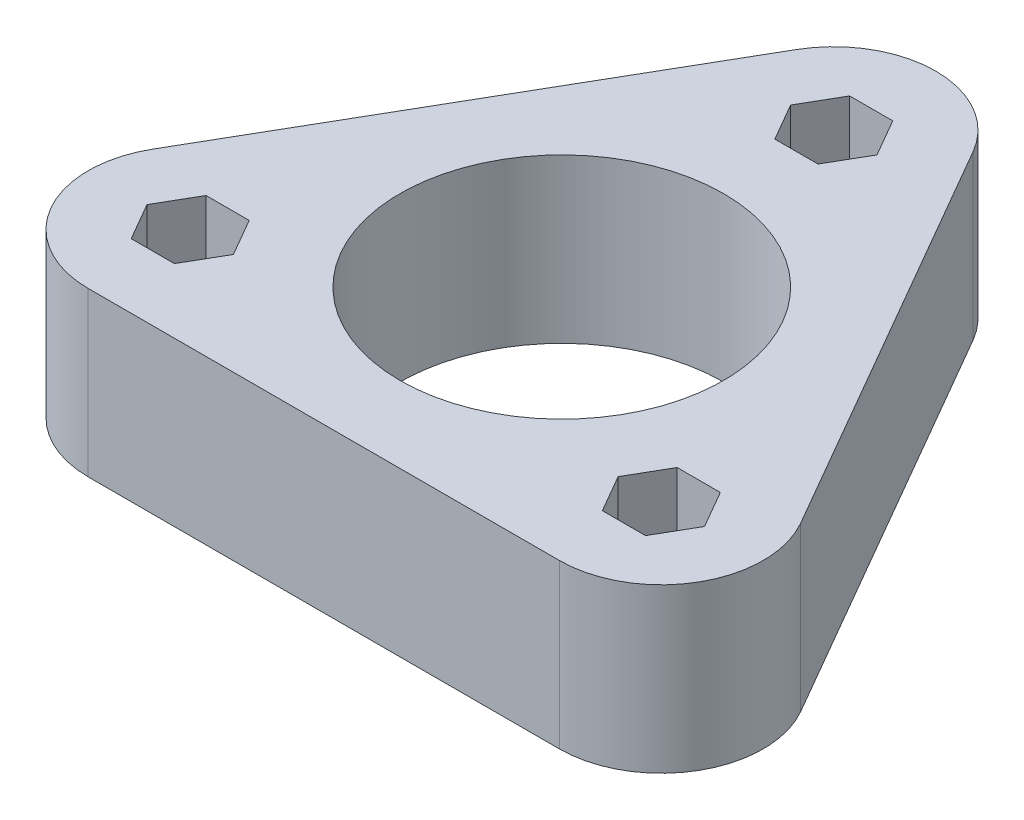
ISO-10303-21;
HEADER;
FILE_DESCRIPTION(('STEP AP214'),'2;1');
FILE_NAME('part.step','',(''),(''),'','','');
FILE_SCHEMA(('AUTOMOTIVE_DESIGN { 1 0 10303 214 1 1 1 1 }'));
ENDSEC;
DATA;
#1=APPLICATION_CONTEXT('core data for automotive mechanical design processes');
#2=APPLICATION_PROTOCOL_DEFINITION('international standard','automotive_design',2000,#1);
#3=PRODUCT_CONTEXT('',#1,'mechanical');
#4=PRODUCT('Part','Part','',(#3));
#5=PRODUCT_RELATED_PRODUCT_CATEGORY('part','',(#4));
#6=PRODUCT_DEFINITION_FORMATION('','',#4);
#7=PRODUCT_DEFINITION_CONTEXT('part definition',#1,'design');
#8=PRODUCT_DEFINITION('design','',#6,#7);
#9=PRODUCT_DEFINITION_SHAPE('','',#8);
#10=(LENGTH_UNIT() NAMED_UNIT(*) SI_UNIT(.MILLI.,.METRE.));
#11=(NAMED_UNIT(*) PLANE_ANGLE_UNIT() SI_UNIT($,.RADIAN.));
#12=(NAMED_UNIT(*) SI_UNIT($,.STERADIAN.) SOLID_ANGLE_UNIT());
#13=UNCERTAINTY_MEASURE_WITH_UNIT(LENGTH_MEASURE(1.E-05),#10,'distance_accuracy_value','');
#14=(GEOMETRIC_REPRESENTATION_CONTEXT(3) GLOBAL_UNCERTAINTY_ASSIGNED_CONTEXT((#13)) GLOBAL_UNIT_ASSIGNED_CONTEXT((#10,
#11,#12)) REPRESENTATION_CONTEXT('',''));
#15=CARTESIAN_POINT('',(0.,0.,0.));
#16=DIRECTION('',(0.,0.,1.));
#17=DIRECTION('',(1.,0.,0.));
#18=AXIS2_PLACEMENT_3D('',#15,#16,#17);
#19=CARTESIAN_POINT('',(17.3205080756887,12.,10.0000000000001));
#20=DIRECTION('',(0.,-1.,0.));
#21=DIRECTION('',(0.,0.,-1.));
#22=AXIS2_PLACEMENT_3D('',#19,#20,#21);
#23=CYLINDRICAL_SURFACE('',#22,1.49999999999999);
#24=CARTESIAN_POINT('',(17.3205080756887,0.,10.0000000000001));
#25=DIRECTION('',(0.,1.,0.));
#26=DIRECTION('',(0.,0.,1.));
#27=AXIS2_PLACEMENT_3D('',#24,#25,#26);
#28=CIRCLE('',#27,1.49999999999999);
#29=CARTESIAN_POINT('',(17.3205080756887,0.,11.5000000000001));
#30=VERTEX_POINT('',#29);
#31=EDGE_CURVE('E345',#30,#30,#28,.T.);
#32=ORIENTED_EDGE('',*,*,#31,.F.);
#33=EDGE_LOOP('',(#32));
#34=FACE_BOUND('',#33,.T.);
#35=CARTESIAN_POINT('',(17.3205080756887,7.,10.0000000000001));
#36=DIRECTION('',(0.,1.,0.));
#37=DIRECTION('',(0.,0.,1.));
#38=AXIS2_PLACEMENT_3D('',#35,#36,#37);
#39=CIRCLE('',#38,1.49999999999999);
#40=CARTESIAN_POINT('',(17.3205080756887,7.,11.5000000000001));
#41=VERTEX_POINT('',#40);
#42=EDGE_CURVE('E36',#41,#41,#39,.T.);
#43=ORIENTED_EDGE('',*,*,#42,.T.);
#44=EDGE_LOOP('',(#43));
#45=FACE_BOUND('',#44,.T.);
#46=ADVANCED_FACE('F32',(#34,#45),#23,.F.);
#47=CARTESIAN_POINT('',(0.,12.,-20.));
#48=DIRECTION('',(0.,-1.,0.));
#49=DIRECTION('',(0.,0.,-1.));
#50=AXIS2_PLACEMENT_3D('',#47,#48,#49);
#51=CYLINDRICAL_SURFACE('',#50,1.5);
#52=CARTESIAN_POINT('',(0.,0.,-20.));
#53=DIRECTION('',(0.,1.,0.));
#54=DIRECTION('',(0.,0.,1.));
#55=AXIS2_PLACEMENT_3D('',#52,#53,#54);
#56=CIRCLE('',#55,1.5);
#57=CARTESIAN_POINT('',(0.,0.,-18.5));
#58=VERTEX_POINT('',#57);
#59=EDGE_CURVE('E351',#58,#58,#56,.T.);
#60=ORIENTED_EDGE('',*,*,#59,.F.);
#61=EDGE_LOOP('',(#60));
#62=FACE_BOUND('',#61,.T.);
#63=CARTESIAN_POINT('',(0.,7.,-20.));
#64=DIRECTION('',(0.,1.,0.));
#65=DIRECTION('',(0.,0.,1.));
#66=AXIS2_PLACEMENT_3D('',#63,#64,#65);
#67=CIRCLE('',#66,1.5);
#68=CARTESIAN_POINT('',(0.,7.,-18.5));
#69=VERTEX_POINT('',#68);
#70=EDGE_CURVE('E286',#69,#69,#67,.T.);
#71=ORIENTED_EDGE('',*,*,#70,.T.);
#72=EDGE_LOOP('',(#71));
#73=FACE_BOUND('',#72,.T.);
#74=ADVANCED_FACE('F404',(#62,#73),#51,.F.);
#75=CARTESIAN_POINT('',(-17.3205080756887,12.,10.0000000000001));
#76=DIRECTION('',(0.,-1.,0.));
#77=DIRECTION('',(0.,0.,-1.));
#78=AXIS2_PLACEMENT_3D('',#75,#76,#77);
#79=CYLINDRICAL_SURFACE('',#78,1.5);
#80=CARTESIAN_POINT('',(-17.3205080756887,0.,10.0000000000001));
#81=DIRECTION('',(0.,1.,0.));
#82=DIRECTION('',(0.,0.,1.));
#83=AXIS2_PLACEMENT_3D('',#80,#81,#82);
#84=CIRCLE('',#83,1.5);
#85=CARTESIAN_POINT('',(-17.3205080756887,0.,11.5000000000001));
#86=VERTEX_POINT('',#85);
#87=EDGE_CURVE('E348',#86,#86,#84,.T.);
#88=ORIENTED_EDGE('',*,*,#87,.F.);
#89=EDGE_LOOP('',(#88));
#90=FACE_BOUND('',#89,.T.);
#91=CARTESIAN_POINT('',(-17.3205080756887,7.,10.0000000000001));
#92=DIRECTION('',(0.,1.,0.));
#93=DIRECTION('',(0.,0.,1.));
#94=AXIS2_PLACEMENT_3D('',#91,#92,#93);
#95=CIRCLE('',#94,1.5);
#96=CARTESIAN_POINT('',(-17.3205080756887,7.,11.5000000000001));
#97=VERTEX_POINT('',#96);
#98=EDGE_CURVE('E334',#97,#97,#95,.T.);
#99=ORIENTED_EDGE('',*,*,#98,.T.);
#100=EDGE_LOOP('',(#99));
#101=FACE_BOUND('',#100,.T.);
#102=ADVANCED_FACE('F437',(#90,#101),#79,.F.);
#103=CARTESIAN_POINT('',(0.,12.,-20.));
#104=DIRECTION('',(0.,1.,0.));
#105=DIRECTION('',(0.,0.,1.));
#106=AXIS2_PLACEMENT_3D('',#103,#104,#105);
#107=PLANE('',#106);
#108=DIRECTION('',(-0.500000000000001,0.,-0.866025403784438));
#109=VECTOR('',#108,1.);
#110=CARTESIAN_POINT('',(20.4959345562317,12.,10.0000000000001));
#111=LINE('',#110,#109);
#112=CARTESIAN_POINT('',(20.4959345562317,12.,10.0000000000001));
#113=VERTEX_POINT('',#112);
#114=CARTESIAN_POINT('',(18.9082213159602,12.,7.25000000000007));
#115=VERTEX_POINT('',#114);
#116=EDGE_CURVE('E49',#113,#115,#111,.T.);
#117=ORIENTED_EDGE('',*,*,#116,.F.);
#118=DIRECTION('',(0.5,0.,-0.866025403784439));
#119=VECTOR('',#118,1.);
#120=CARTESIAN_POINT('',(18.9082213159602,12.,12.7500000000001));
#121=LINE('',#120,#119);
#122=CARTESIAN_POINT('',(18.9082213159602,12.,12.7500000000001));
#123=VERTEX_POINT('',#122);
#124=EDGE_CURVE('E216',#123,#113,#121,.T.);
#125=ORIENTED_EDGE('',*,*,#124,.F.);
#126=DIRECTION('',(1.,0.,0.));
#127=VECTOR('',#126,1.);
#128=CARTESIAN_POINT('',(15.7327948354173,12.,12.7500000000001));
#129=LINE('',#128,#127);
#130=CARTESIAN_POINT('',(15.7327948354173,12.,12.7500000000001));
#131=VERTEX_POINT('',#130);
#132=EDGE_CURVE('E219',#131,#123,#129,.T.);
#133=ORIENTED_EDGE('',*,*,#132,.F.);
#134=DIRECTION('',(0.500000000000001,0.,0.866025403784438));
#135=VECTOR('',#134,1.);
#136=CARTESIAN_POINT('',(14.1450815951458,12.,10.0000000000001));
#137=LINE('',#136,#135);
#138=CARTESIAN_POINT('',(14.1450815951458,12.,10.0000000000001));
#139=VERTEX_POINT('',#138);
#140=EDGE_CURVE('E235',#139,#131,#137,.T.);
#141=ORIENTED_EDGE('',*,*,#140,.F.);
#142=DIRECTION('',(-0.500000000000001,0.,0.866025403784438));
#143=VECTOR('',#142,1.);
#144=CARTESIAN_POINT('',(15.7327948354173,12.,7.25000000000008));
#145=LINE('',#144,#143);
#146=CARTESIAN_POINT('',(15.7327948354173,12.,7.25000000000008));
#147=VERTEX_POINT('',#146);
#148=EDGE_CURVE('E232',#147,#139,#145,.T.);
#149=ORIENTED_EDGE('',*,*,#148,.F.);
#150=DIRECTION('',(-1.,0.,0.));
#151=VECTOR('',#150,1.);
#152=CARTESIAN_POINT('',(18.9082213159602,12.,7.25000000000008));
#153=LINE('',#152,#151);
#154=EDGE_CURVE('E230',#115,#147,#153,.T.);
#155=ORIENTED_EDGE('',*,*,#154,.F.);
#156=EDGE_LOOP('',(#117,#125,#133,#141,#149,#155));
#157=FACE_BOUND('',#156,.T.);
#158=DIRECTION('',(-1.,0.,0.));
#159=VECTOR('',#158,1.);
#160=CARTESIAN_POINT('',(1.58771324027147,12.,-22.75));
#161=LINE('',#160,#159);
#162=CARTESIAN_POINT('',(1.58771324027147,12.,-22.75));
#163=VERTEX_POINT('',#162);
#164=CARTESIAN_POINT('',(-1.58771324027147,12.,-22.75));
#165=VERTEX_POINT('',#164);
#166=EDGE_CURVE('E57',#163,#165,#161,.T.);
#167=ORIENTED_EDGE('',*,*,#166,.F.);
#168=DIRECTION('',(-0.5,0.,-0.866025403784439));
#169=VECTOR('',#168,1.);
#170=CARTESIAN_POINT('',(3.17542648054294,12.,-20.));
#171=LINE('',#170,#169);
#172=CARTESIAN_POINT('',(3.17542648054294,12.,-20.));
#173=VERTEX_POINT('',#172);
#174=EDGE_CURVE('E253',#173,#163,#171,.T.);
#175=ORIENTED_EDGE('',*,*,#174,.F.);
#176=DIRECTION('',(0.5,0.,-0.866025403784439));
#177=VECTOR('',#176,1.);
#178=CARTESIAN_POINT('',(1.58771324027147,12.,-17.25));
#179=LINE('',#178,#177);
#180=CARTESIAN_POINT('',(1.58771324027147,12.,-17.25));
#181=VERTEX_POINT('',#180);
#182=EDGE_CURVE('E279',#181,#173,#179,.T.);
#183=ORIENTED_EDGE('',*,*,#182,.F.);
#184=DIRECTION('',(1.,0.,0.));
#185=VECTOR('',#184,1.);
#186=CARTESIAN_POINT('',(-1.58771324027147,12.,-17.25));
#187=LINE('',#186,#185);
#188=CARTESIAN_POINT('',(-1.58771324027147,12.,-17.25));
#189=VERTEX_POINT('',#188);
#190=EDGE_CURVE('E276',#189,#181,#187,.T.);
#191=ORIENTED_EDGE('',*,*,#190,.F.);
#192=DIRECTION('',(0.5,0.,0.866025403784439));
#193=VECTOR('',#192,1.);
#194=CARTESIAN_POINT('',(-3.17542648054294,12.,-20.));
#195=LINE('',#194,#193);
#196=CARTESIAN_POINT('',(-3.17542648054294,12.,-20.));
#197=VERTEX_POINT('',#196);
#198=EDGE_CURVE('E273',#197,#189,#195,.T.);
#199=ORIENTED_EDGE('',*,*,#198,.F.);
#200=DIRECTION('',(-0.499999999999999,0.,0.866025403784439));
#201=VECTOR('',#200,1.);
#202=CARTESIAN_POINT('',(-1.58771324027147,12.,-22.75));
#203=LINE('',#202,#201);
#204=EDGE_CURVE('E270',#165,#197,#203,.T.);
#205=ORIENTED_EDGE('',*,*,#204,.F.);
#206=EDGE_LOOP('',(#167,#175,#183,#191,#199,#205));
#207=FACE_BOUND('',#206,.T.);
#208=DIRECTION('',(-1.,0.,0.));
#209=VECTOR('',#208,1.);
#210=CARTESIAN_POINT('',(-15.7327948354173,12.,7.25000000000008));
#211=LINE('',#210,#209);
#212=CARTESIAN_POINT('',(-15.7327948354173,12.,7.25000000000008));
#213=VERTEX_POINT('',#212);
#214=CARTESIAN_POINT('',(-18.9082213159602,12.,7.25000000000008));
#215=VERTEX_POINT('',#214);
#216=EDGE_CURVE('E316',#213,#215,#211,.T.);
#217=ORIENTED_EDGE('',*,*,#216,.F.);
#218=DIRECTION('',(-0.5,0.,-0.866025403784439));
#219=VECTOR('',#218,1.);
#220=CARTESIAN_POINT('',(-14.1450815951458,12.,10.0000000000001));
#221=LINE('',#220,#219);
#222=CARTESIAN_POINT('',(-14.1450815951458,12.,10.0000000000001));
#223=VERTEX_POINT('',#222);
#224=EDGE_CURVE('E300',#223,#213,#221,.T.);
#225=ORIENTED_EDGE('',*,*,#224,.F.);
#226=DIRECTION('',(0.5,0.,-0.866025403784439));
#227=VECTOR('',#226,1.);
#228=CARTESIAN_POINT('',(-15.7327948354173,12.,12.7500000000001));
#229=LINE('',#228,#227);
#230=CARTESIAN_POINT('',(-15.7327948354173,12.,12.7500000000001));
#231=VERTEX_POINT('',#230);
#232=EDGE_CURVE('E327',#231,#223,#229,.T.);
#233=ORIENTED_EDGE('',*,*,#232,.F.);
#234=DIRECTION('',(1.,0.,0.));
#235=VECTOR('',#234,1.);
#236=CARTESIAN_POINT('',(-18.9082213159602,12.,12.7500000000001));
#237=LINE('',#236,#235);
#238=CARTESIAN_POINT('',(-18.9082213159602,12.,12.7500000000001));
#239=VERTEX_POINT('',#238);
#240=EDGE_CURVE('E324',#239,#231,#237,.T.);
#241=ORIENTED_EDGE('',*,*,#240,.F.);
#242=DIRECTION('',(0.5,0.,0.866025403784439));
#243=VECTOR('',#242,1.);
#244=CARTESIAN_POINT('',(-20.4959345562317,12.,10.0000000000001));
#245=LINE('',#244,#243);
#246=CARTESIAN_POINT('',(-20.4959345562317,12.,10.0000000000001));
#247=VERTEX_POINT('',#246);
#248=EDGE_CURVE('E321',#247,#239,#245,.T.);
#249=ORIENTED_EDGE('',*,*,#248,.F.);
#250=DIRECTION('',(-0.5,0.,0.866025403784439));
#251=VECTOR('',#250,1.);
#252=CARTESIAN_POINT('',(-18.9082213159602,12.,7.25000000000008));
#253=LINE('',#252,#251);
#254=EDGE_CURVE('E318',#215,#247,#253,.T.);
#255=ORIENTED_EDGE('',*,*,#254,.F.);
#256=EDGE_LOOP('',(#217,#225,#233,#241,#249,#255));
#257=FACE_BOUND('',#256,.T.);
#258=CARTESIAN_POINT('',(0.,12.,0.));
#259=DIRECTION('',(0.,1.,0.));
#260=DIRECTION('',(0.,0.,1.));
#261=AXIS2_PLACEMENT_3D('',#258,#259,#260);
#262=CIRCLE('',#261,11.9);
#263=CARTESIAN_POINT('',(0.,12.,11.9));
#264=VERTEX_POINT('',#263);
#265=EDGE_CURVE('E355',#264,#264,#262,.T.);
#266=ORIENTED_EDGE('',*,*,#265,.F.);
#267=EDGE_LOOP('',(#266));
#268=FACE_BOUND('',#267,.T.);
#269=CARTESIAN_POINT('',(0.,12.,-20.));
#270=DIRECTION('',(0.,1.,0.));
#271=DIRECTION('',(0.,0.,1.));
#272=AXIS2_PLACEMENT_3D('',#269,#270,#271);
#273=CIRCLE('',#272,7.49999999999992);
#274=CARTESIAN_POINT('',(6.49519052838323,12.,-23.7499999999999));
#275=VERTEX_POINT('',#274);
#276=CARTESIAN_POINT('',(-6.49519052838323,12.,-23.7499999999999));
#277=VERTEX_POINT('',#276);
#278=EDGE_CURVE('E361',#275,#277,#273,.T.);
#279=ORIENTED_EDGE('',*,*,#278,.T.);
#280=DIRECTION('',(-0.499999999999998,0.,0.86602540378444));
#281=VECTOR('',#280,1.);
#282=CARTESIAN_POINT('',(-6.49519052838323,12.,-23.7499999999999));
#283=LINE('',#282,#281);
#284=CARTESIAN_POINT('',(-23.815698604072,12.,6.25000000000013));
#285=VERTEX_POINT('',#284);
#286=EDGE_CURVE('E364',#277,#285,#283,.T.);
#287=ORIENTED_EDGE('',*,*,#286,.T.);
#288=CARTESIAN_POINT('',(-17.3205080756887,12.,10.0000000000001));
#289=DIRECTION('',(0.,1.,0.));
#290=DIRECTION('',(0.,0.,1.));
#291=AXIS2_PLACEMENT_3D('',#288,#289,#290);
#292=CIRCLE('',#291,7.49999999999993);
#293=CARTESIAN_POINT('',(-17.3205080756887,12.,17.5));
#294=VERTEX_POINT('',#293);
#295=EDGE_CURVE('E367',#285,#294,#292,.T.);
#296=ORIENTED_EDGE('',*,*,#295,.T.);
#297=DIRECTION('',(1.,0.,0.));
#298=VECTOR('',#297,1.);
#299=CARTESIAN_POINT('',(-17.3205080756887,12.,17.5));
#300=LINE('',#299,#298);
#301=CARTESIAN_POINT('',(17.3205080756887,12.,17.5));
#302=VERTEX_POINT('',#301);
#303=EDGE_CURVE('E369',#294,#302,#300,.T.);
#304=ORIENTED_EDGE('',*,*,#303,.T.);
#305=CARTESIAN_POINT('',(17.3205080756887,12.,10.0000000000001));
#306=DIRECTION('',(0.,1.,0.));
#307=DIRECTION('',(0.,0.,1.));
#308=AXIS2_PLACEMENT_3D('',#305,#306,#307);
#309=CIRCLE('',#308,7.49999999999992);
#310=CARTESIAN_POINT('',(23.815698604072,12.,6.25000000000013));
#311=VERTEX_POINT('',#310);
#312=EDGE_CURVE('E371',#302,#311,#309,.T.);
#313=ORIENTED_EDGE('',*,*,#312,.T.);
#314=DIRECTION('',(-0.499999999999998,0.,-0.86602540378444));
#315=VECTOR('',#314,1.);
#316=CARTESIAN_POINT('',(6.49519052838323,12.,-23.7499999999999));
#317=LINE('',#316,#315);
#318=EDGE_CURVE('E373',#311,#275,#317,.T.);
#319=ORIENTED_EDGE('',*,*,#318,.T.);
#320=EDGE_LOOP('',(#279,#287,#296,#304,#313,#319));
#321=FACE_BOUND('',#320,.T.);
#322=ADVANCED_FACE('F433',(#157,#207,#257,#268,#321),#107,.T.);
#323=CARTESIAN_POINT('',(0.,0.,-20.));
#324=DIRECTION('',(0.,1.,0.));
#325=DIRECTION('',(0.,0.,1.));
#326=AXIS2_PLACEMENT_3D('',#323,#324,#325);
#327=PLANE('',#326);
#328=ORIENTED_EDGE('',*,*,#87,.T.);
#329=EDGE_LOOP('',(#328));
#330=FACE_BOUND('',#329,.T.);
#331=CARTESIAN_POINT('',(0.,0.,0.));
#332=DIRECTION('',(0.,1.,0.));
#333=DIRECTION('',(0.,0.,1.));
#334=AXIS2_PLACEMENT_3D('',#331,#332,#333);
#335=CIRCLE('',#334,11.9);
#336=CARTESIAN_POINT('',(0.,0.,11.9));
#337=VERTEX_POINT('',#336);
#338=EDGE_CURVE('E354',#337,#337,#335,.T.);
#339=ORIENTED_EDGE('',*,*,#338,.T.);
#340=EDGE_LOOP('',(#339));
#341=FACE_BOUND('',#340,.T.);
#342=CARTESIAN_POINT('',(0.,0.,-20.));
#343=DIRECTION('',(0.,1.,0.));
#344=DIRECTION('',(0.,0.,1.));
#345=AXIS2_PLACEMENT_3D('',#342,#343,#344);
#346=CIRCLE('',#345,7.49999999999992);
#347=CARTESIAN_POINT('',(6.49519052838323,0.,-23.7499999999999));
#348=VERTEX_POINT('',#347);
#349=CARTESIAN_POINT('',(-6.49519052838323,0.,-23.7499999999999));
#350=VERTEX_POINT('',#349);
#351=EDGE_CURVE('E358',#348,#350,#346,.T.);
#352=ORIENTED_EDGE('',*,*,#351,.F.);
#353=DIRECTION('',(-0.499999999999998,0.,-0.86602540378444));
#354=VECTOR('',#353,1.);
#355=CARTESIAN_POINT('',(6.49519052838323,0.,-23.7499999999999));
#356=LINE('',#355,#354);
#357=CARTESIAN_POINT('',(23.815698604072,0.,6.25000000000013));
#358=VERTEX_POINT('',#357);
#359=EDGE_CURVE('E365',#358,#348,#356,.T.);
#360=ORIENTED_EDGE('',*,*,#359,.F.);
#361=CARTESIAN_POINT('',(17.3205080756887,0.,10.0000000000001));
#362=DIRECTION('',(0.,1.,0.));
#363=DIRECTION('',(0.,0.,1.));
#364=AXIS2_PLACEMENT_3D('',#361,#362,#363);
#365=CIRCLE('',#364,7.49999999999992);
#366=CARTESIAN_POINT('',(17.3205080756887,0.,17.5));
#367=VERTEX_POINT('',#366);
#368=EDGE_CURVE('E384',#367,#358,#365,.T.);
#369=ORIENTED_EDGE('',*,*,#368,.F.);
#370=DIRECTION('',(1.,0.,0.));
#371=VECTOR('',#370,1.);
#372=CARTESIAN_POINT('',(-17.3205080756887,0.,17.5));
#373=LINE('',#372,#371);
#374=CARTESIAN_POINT('',(-17.3205080756887,0.,17.5));
#375=VERTEX_POINT('',#374);
#376=EDGE_CURVE('E382',#375,#367,#373,.T.);
#377=ORIENTED_EDGE('',*,*,#376,.F.);
#378=CARTESIAN_POINT('',(-17.3205080756887,0.,10.0000000000001));
#379=DIRECTION('',(0.,1.,0.));
#380=DIRECTION('',(0.,0.,1.));
#381=AXIS2_PLACEMENT_3D('',#378,#379,#380);
#382=CIRCLE('',#381,7.49999999999993);
#383=CARTESIAN_POINT('',(-23.815698604072,0.,6.25000000000013));
#384=VERTEX_POINT('',#383);
#385=EDGE_CURVE('E380',#384,#375,#382,.T.);
#386=ORIENTED_EDGE('',*,*,#385,.F.);
#387=DIRECTION('',(-0.499999999999998,0.,0.86602540378444));
#388=VECTOR('',#387,1.);
#389=CARTESIAN_POINT('',(-6.49519052838323,0.,-23.7499999999999));
#390=LINE('',#389,#388);
#391=EDGE_CURVE('E378',#350,#384,#390,.T.);
#392=ORIENTED_EDGE('',*,*,#391,.F.);
#393=EDGE_LOOP('',(#352,#360,#369,#377,#386,#392));
#394=FACE_BOUND('',#393,.T.);
#395=ORIENTED_EDGE('',*,*,#59,.T.);
#396=EDGE_LOOP('',(#395));
#397=FACE_BOUND('',#396,.T.);
#398=ORIENTED_EDGE('',*,*,#31,.T.);
#399=EDGE_LOOP('',(#398));
#400=FACE_BOUND('',#399,.T.);
#401=ADVANCED_FACE('F436',(#330,#341,#394,#397,#400),#327,.F.);
#402=CARTESIAN_POINT('',(0.,12.,-20.));
#403=DIRECTION('',(0.,-1.,0.));
#404=DIRECTION('',(0.,0.,-1.));
#405=AXIS2_PLACEMENT_3D('',#402,#403,#404);
#406=CYLINDRICAL_SURFACE('',#405,7.49999999999992);
#407=ORIENTED_EDGE('',*,*,#351,.T.);
#408=DIRECTION('',(0.,-1.,0.));
#409=VECTOR('',#408,1.);
#410=CARTESIAN_POINT('',(-6.49519052838323,12.,-23.7499999999999));
#411=LINE('',#410,#409);
#412=EDGE_CURVE('E11',#277,#350,#411,.T.);
#413=ORIENTED_EDGE('',*,*,#412,.F.);
#414=ORIENTED_EDGE('',*,*,#278,.F.);
#415=DIRECTION('',(0.,-1.,0.));
#416=VECTOR('',#415,1.);
#417=CARTESIAN_POINT('',(6.49519052838323,12.,-23.7499999999999));
#418=LINE('',#417,#416);
#419=EDGE_CURVE('E375',#275,#348,#418,.T.);
#420=ORIENTED_EDGE('',*,*,#419,.T.);
#421=EDGE_LOOP('',(#407,#413,#414,#420));
#422=FACE_BOUND('',#421,.T.);
#423=ADVANCED_FACE('F34',(#422),#406,.T.);
#424=CARTESIAN_POINT('',(-6.49519052838323,12.,-23.7499999999999));
#425=DIRECTION('',(0.86602540378444,0.,0.499999999999998));
#426=DIRECTION('',(0.499999999999998,0.,-0.86602540378444));
#427=AXIS2_PLACEMENT_3D('',#424,#425,#426);
#428=PLANE('',#427);
#429=ORIENTED_EDGE('',*,*,#391,.T.);
#430=DIRECTION('',(0.,-1.,0.));
#431=VECTOR('',#430,1.);
#432=CARTESIAN_POINT('',(-23.815698604072,12.,6.25000000000013));
#433=LINE('',#432,#431);
#434=EDGE_CURVE('E41',#285,#384,#433,.T.);
#435=ORIENTED_EDGE('',*,*,#434,.F.);
#436=ORIENTED_EDGE('',*,*,#286,.F.);
#437=ORIENTED_EDGE('',*,*,#412,.T.);
#438=EDGE_LOOP('',(#429,#435,#436,#437));
#439=FACE_BOUND('',#438,.T.);
#440=ADVANCED_FACE('F454',(#439),#428,.F.);
#441=CARTESIAN_POINT('',(-17.3205080756887,12.,10.0000000000001));
#442=DIRECTION('',(0.,-1.,0.));
#443=DIRECTION('',(0.,0.,-1.));
#444=AXIS2_PLACEMENT_3D('',#441,#442,#443);
#445=CYLINDRICAL_SURFACE('',#444,7.49999999999993);
#446=ORIENTED_EDGE('',*,*,#385,.T.);
#447=DIRECTION('',(0.,-1.,0.));
#448=VECTOR('',#447,1.);
#449=CARTESIAN_POINT('',(-17.3205080756887,12.,17.5));
#450=LINE('',#449,#448);
#451=EDGE_CURVE('E395',#294,#375,#450,.T.);
#452=ORIENTED_EDGE('',*,*,#451,.F.);
#453=ORIENTED_EDGE('',*,*,#295,.F.);
#454=ORIENTED_EDGE('',*,*,#434,.T.);
#455=EDGE_LOOP('',(#446,#452,#453,#454));
#456=FACE_BOUND('',#455,.T.);
#457=ADVANCED_FACE('F459',(#456),#445,.T.);
#458=CARTESIAN_POINT('',(-17.3205080756887,12.,17.5));
#459=DIRECTION('',(0.,0.,-1.));
#460=DIRECTION('',(-1.,0.,0.));
#461=AXIS2_PLACEMENT_3D('',#458,#459,#460);
#462=PLANE('',#461);
#463=ORIENTED_EDGE('',*,*,#376,.T.);
#464=DIRECTION('',(0.,-1.,0.));
#465=VECTOR('',#464,1.);
#466=CARTESIAN_POINT('',(17.3205080756887,12.,17.5));
#467=LINE('',#466,#465);
#468=EDGE_CURVE('E392',#302,#367,#467,.T.);
#469=ORIENTED_EDGE('',*,*,#468,.F.);
#470=ORIENTED_EDGE('',*,*,#303,.F.);
#471=ORIENTED_EDGE('',*,*,#451,.T.);
#472=EDGE_LOOP('',(#463,#469,#470,#471));
#473=FACE_BOUND('',#472,.T.);
#474=ADVANCED_FACE('F465',(#473),#462,.F.);
#475=CARTESIAN_POINT('',(17.3205080756887,12.,10.0000000000001));
#476=DIRECTION('',(0.,-1.,0.));
#477=DIRECTION('',(0.,0.,-1.));
#478=AXIS2_PLACEMENT_3D('',#475,#476,#477);
#479=CYLINDRICAL_SURFACE('',#478,7.49999999999992);
#480=ORIENTED_EDGE('',*,*,#368,.T.);
#481=DIRECTION('',(0.,-1.,0.));
#482=VECTOR('',#481,1.);
#483=CARTESIAN_POINT('',(23.815698604072,12.,6.25000000000013));
#484=LINE('',#483,#482);
#485=EDGE_CURVE('E389',#311,#358,#484,.T.);
#486=ORIENTED_EDGE('',*,*,#485,.F.);
#487=ORIENTED_EDGE('',*,*,#312,.F.);
#488=ORIENTED_EDGE('',*,*,#468,.T.);
#489=EDGE_LOOP('',(#480,#486,#487,#488));
#490=FACE_BOUND('',#489,.T.);
#491=ADVANCED_FACE('F469',(#490),#479,.T.);
#492=CARTESIAN_POINT('',(6.49519052838323,12.,-23.7499999999999));
#493=DIRECTION('',(-0.86602540378444,0.,0.499999999999998));
#494=DIRECTION('',(0.499999999999998,0.,0.86602540378444));
#495=AXIS2_PLACEMENT_3D('',#492,#493,#494);
#496=PLANE('',#495);
#497=ORIENTED_EDGE('',*,*,#359,.T.);
#498=ORIENTED_EDGE('',*,*,#419,.F.);
#499=ORIENTED_EDGE('',*,*,#318,.F.);
#500=ORIENTED_EDGE('',*,*,#485,.T.);
#501=EDGE_LOOP('',(#497,#498,#499,#500));
#502=FACE_BOUND('',#501,.T.);
#503=ADVANCED_FACE('F472',(#502),#496,.F.);
#504=CARTESIAN_POINT('',(0.,12.,0.));
#505=DIRECTION('',(0.,-1.,0.));
#506=DIRECTION('',(0.,0.,-1.));
#507=AXIS2_PLACEMENT_3D('',#504,#505,#506);
#508=CYLINDRICAL_SURFACE('',#507,11.9);
#509=ORIENTED_EDGE('',*,*,#265,.T.);
#510=EDGE_LOOP('',(#509));
#511=FACE_BOUND('',#510,.T.);
#512=ORIENTED_EDGE('',*,*,#338,.F.);
#513=EDGE_LOOP('',(#512));
#514=FACE_BOUND('',#513,.T.);
#515=ADVANCED_FACE('F551',(#511,#514),#508,.F.);
#516=CARTESIAN_POINT('',(-15.7327948354173,7.,7.25000000000008));
#517=DIRECTION('',(0.,0.,-1.));
#518=DIRECTION('',(-1.,0.,0.));
#519=AXIS2_PLACEMENT_3D('',#516,#517,#518);
#520=PLANE('',#519);
#521=ORIENTED_EDGE('',*,*,#216,.T.);
#522=DIRECTION('',(0.,1.,0.));
#523=VECTOR('',#522,1.);
#524=CARTESIAN_POINT('',(-18.9082213159602,7.,7.25000000000008));
#525=LINE('',#524,#523);
#526=CARTESIAN_POINT('',(-18.9082213159602,7.,7.25000000000008));
#527=VERTEX_POINT('',#526);
#528=EDGE_CURVE('E315',#527,#215,#525,.T.);
#529=ORIENTED_EDGE('',*,*,#528,.F.);
#530=DIRECTION('',(-1.,0.,0.));
#531=VECTOR('',#530,1.);
#532=CARTESIAN_POINT('',(-15.7327948354173,7.,7.25000000000008));
#533=LINE('',#532,#531);
#534=CARTESIAN_POINT('',(-15.7327948354173,7.,7.25000000000008));
#535=VERTEX_POINT('',#534);
#536=EDGE_CURVE('E296',#535,#527,#533,.T.);
#537=ORIENTED_EDGE('',*,*,#536,.F.);
#538=DIRECTION('',(0.,1.,0.));
#539=VECTOR('',#538,1.);
#540=CARTESIAN_POINT('',(-15.7327948354173,7.,7.25000000000008));
#541=LINE('',#540,#539);
#542=EDGE_CURVE('E332',#535,#213,#541,.T.);
#543=ORIENTED_EDGE('',*,*,#542,.T.);
#544=EDGE_LOOP('',(#521,#529,#537,#543));
#545=FACE_BOUND('',#544,.T.);
#546=ADVANCED_FACE('F534',(#545),#520,.F.);
#547=CARTESIAN_POINT('',(-14.1450815951458,7.,10.0000000000001));
#548=DIRECTION('',(0.866025403784439,0.,-0.5));
#549=DIRECTION('',(-0.5,0.,-0.866025403784439));
#550=AXIS2_PLACEMENT_3D('',#547,#548,#549);
#551=PLANE('',#550);
#552=ORIENTED_EDGE('',*,*,#224,.T.);
#553=ORIENTED_EDGE('',*,*,#542,.F.);
#554=DIRECTION('',(-0.5,0.,-0.866025403784439));
#555=VECTOR('',#554,1.);
#556=CARTESIAN_POINT('',(-14.1450815951458,7.,10.0000000000001));
#557=LINE('',#556,#555);
#558=CARTESIAN_POINT('',(-14.1450815951458,7.,10.0000000000001));
#559=VERTEX_POINT('',#558);
#560=EDGE_CURVE('E312',#559,#535,#557,.T.);
#561=ORIENTED_EDGE('',*,*,#560,.F.);
#562=DIRECTION('',(0.,1.,0.));
#563=VECTOR('',#562,1.);
#564=CARTESIAN_POINT('',(-14.1450815951458,7.,10.0000000000001));
#565=LINE('',#564,#563);
#566=EDGE_CURVE('E335',#559,#223,#565,.T.);
#567=ORIENTED_EDGE('',*,*,#566,.T.);
#568=EDGE_LOOP('',(#552,#553,#561,#567));
#569=FACE_BOUND('',#568,.T.);
#570=ADVANCED_FACE('F530',(#569),#551,.F.);
#571=CARTESIAN_POINT('',(-15.7327948354173,7.,12.7500000000001));
#572=DIRECTION('',(0.866025403784439,0.,0.5));
#573=DIRECTION('',(0.5,0.,-0.866025403784439));
#574=AXIS2_PLACEMENT_3D('',#571,#572,#573);
#575=PLANE('',#574);
#576=ORIENTED_EDGE('',*,*,#232,.T.);
#577=ORIENTED_EDGE('',*,*,#566,.F.);
#578=DIRECTION('',(0.5,0.,-0.866025403784439));
#579=VECTOR('',#578,1.);
#580=CARTESIAN_POINT('',(-15.7327948354173,7.,12.7500000000001));
#581=LINE('',#580,#579);
#582=CARTESIAN_POINT('',(-15.7327948354173,7.,12.7500000000001));
#583=VERTEX_POINT('',#582);
#584=EDGE_CURVE('E309',#583,#559,#581,.T.);
#585=ORIENTED_EDGE('',*,*,#584,.F.);
#586=DIRECTION('',(0.,1.,0.));
#587=VECTOR('',#586,1.);
#588=CARTESIAN_POINT('',(-15.7327948354173,7.,12.7500000000001));
#589=LINE('',#588,#587);
#590=EDGE_CURVE('E337',#583,#231,#589,.T.);
#591=ORIENTED_EDGE('',*,*,#590,.T.);
#592=EDGE_LOOP('',(#576,#577,#585,#591));
#593=FACE_BOUND('',#592,.T.);
#594=ADVANCED_FACE('F533',(#593),#575,.F.);
#595=CARTESIAN_POINT('',(-18.9082213159602,7.,12.7500000000001));
#596=DIRECTION('',(0.,0.,1.));
#597=DIRECTION('',(1.,0.,0.));
#598=AXIS2_PLACEMENT_3D('',#595,#596,#597);
#599=PLANE('',#598);
#600=ORIENTED_EDGE('',*,*,#240,.T.);
#601=ORIENTED_EDGE('',*,*,#590,.F.);
#602=DIRECTION('',(1.,0.,0.));
#603=VECTOR('',#602,1.);
#604=CARTESIAN_POINT('',(-18.9082213159602,7.,12.7500000000001));
#605=LINE('',#604,#603);
#606=CARTESIAN_POINT('',(-18.9082213159602,7.,12.7500000000001));
#607=VERTEX_POINT('',#606);
#608=EDGE_CURVE('E306',#607,#583,#605,.T.);
#609=ORIENTED_EDGE('',*,*,#608,.F.);
#610=DIRECTION('',(0.,1.,0.));
#611=VECTOR('',#610,1.);
#612=CARTESIAN_POINT('',(-18.9082213159602,7.,12.7500000000001));
#613=LINE('',#612,#611);
#614=EDGE_CURVE('E339',#607,#239,#613,.T.);
#615=ORIENTED_EDGE('',*,*,#614,.T.);
#616=EDGE_LOOP('',(#600,#601,#609,#615));
#617=FACE_BOUND('',#616,.T.);
#618=ADVANCED_FACE('F538',(#617),#599,.F.);
#619=CARTESIAN_POINT('',(-20.4959345562317,7.,10.0000000000001));
#620=DIRECTION('',(-0.866025403784439,0.,0.5));
#621=DIRECTION('',(0.5,0.,0.866025403784439));
#622=AXIS2_PLACEMENT_3D('',#619,#620,#621);
#623=PLANE('',#622);
#624=ORIENTED_EDGE('',*,*,#248,.T.);
#625=ORIENTED_EDGE('',*,*,#614,.F.);
#626=DIRECTION('',(0.5,0.,0.866025403784439));
#627=VECTOR('',#626,1.);
#628=CARTESIAN_POINT('',(-20.4959345562317,7.,10.0000000000001));
#629=LINE('',#628,#627);
#630=CARTESIAN_POINT('',(-20.4959345562317,7.,10.0000000000001));
#631=VERTEX_POINT('',#630);
#632=EDGE_CURVE('E303',#631,#607,#629,.T.);
#633=ORIENTED_EDGE('',*,*,#632,.F.);
#634=DIRECTION('',(0.,1.,0.));
#635=VECTOR('',#634,1.);
#636=CARTESIAN_POINT('',(-20.4959345562317,7.,10.0000000000001));
#637=LINE('',#636,#635);
#638=EDGE_CURVE('E341',#631,#247,#637,.T.);
#639=ORIENTED_EDGE('',*,*,#638,.T.);
#640=EDGE_LOOP('',(#624,#625,#633,#639));
#641=FACE_BOUND('',#640,.T.);
#642=ADVANCED_FACE('F542',(#641),#623,.F.);
#643=CARTESIAN_POINT('',(-18.9082213159602,7.,7.25000000000008));
#644=DIRECTION('',(-0.866025403784439,0.,-0.5));
#645=DIRECTION('',(-0.5,0.,0.866025403784439));
#646=AXIS2_PLACEMENT_3D('',#643,#644,#645);
#647=PLANE('',#646);
#648=ORIENTED_EDGE('',*,*,#254,.T.);
#649=ORIENTED_EDGE('',*,*,#638,.F.);
#650=DIRECTION('',(-0.5,0.,0.866025403784439));
#651=VECTOR('',#650,1.);
#652=CARTESIAN_POINT('',(-18.9082213159602,7.,7.25000000000008));
#653=LINE('',#652,#651);
#654=EDGE_CURVE('E299',#527,#631,#653,.T.);
#655=ORIENTED_EDGE('',*,*,#654,.F.);
#656=ORIENTED_EDGE('',*,*,#528,.T.);
#657=EDGE_LOOP('',(#648,#649,#655,#656));
#658=FACE_BOUND('',#657,.T.);
#659=ADVANCED_FACE('F528',(#658),#647,.F.);
#660=CARTESIAN_POINT('',(0.,7.,0.));
#661=DIRECTION('',(0.,1.,0.));
#662=DIRECTION('',(0.,0.,1.));
#663=AXIS2_PLACEMENT_3D('',#660,#661,#662);
#664=PLANE('',#663);
#665=ORIENTED_EDGE('',*,*,#98,.F.);
#666=EDGE_LOOP('',(#665));
#667=FACE_BOUND('',#666,.T.);
#668=ORIENTED_EDGE('',*,*,#536,.T.);
#669=ORIENTED_EDGE('',*,*,#654,.T.);
#670=ORIENTED_EDGE('',*,*,#632,.T.);
#671=ORIENTED_EDGE('',*,*,#608,.T.);
#672=ORIENTED_EDGE('',*,*,#584,.T.);
#673=ORIENTED_EDGE('',*,*,#560,.T.);
#674=EDGE_LOOP('',(#668,#669,#670,#671,#672,#673));
#675=FACE_BOUND('',#674,.T.);
#676=ADVANCED_FACE('F525',(#667,#675),#664,.T.);
#677=CARTESIAN_POINT('',(1.58771324027147,7.,-22.75));
#678=DIRECTION('',(0.,0.,-1.));
#679=DIRECTION('',(-1.,0.,0.));
#680=AXIS2_PLACEMENT_3D('',#677,#678,#679);
#681=PLANE('',#680);
#682=ORIENTED_EDGE('',*,*,#166,.T.);
#683=DIRECTION('',(0.,1.,0.));
#684=VECTOR('',#683,1.);
#685=CARTESIAN_POINT('',(-1.58771324027147,7.,-22.75));
#686=LINE('',#685,#684);
#687=CARTESIAN_POINT('',(-1.58771324027147,7.,-22.75));
#688=VERTEX_POINT('',#687);
#689=EDGE_CURVE('E268',#688,#165,#686,.T.);
#690=ORIENTED_EDGE('',*,*,#689,.F.);
#691=DIRECTION('',(-1.,0.,0.));
#692=VECTOR('',#691,1.);
#693=CARTESIAN_POINT('',(1.58771324027147,7.,-22.75));
#694=LINE('',#693,#692);
#695=CARTESIAN_POINT('',(1.58771324027147,7.,-22.75));
#696=VERTEX_POINT('',#695);
#697=EDGE_CURVE('E249',#696,#688,#694,.T.);
#698=ORIENTED_EDGE('',*,*,#697,.F.);
#699=DIRECTION('',(0.,1.,0.));
#700=VECTOR('',#699,1.);
#701=CARTESIAN_POINT('',(1.58771324027147,7.,-22.75));
#702=LINE('',#701,#700);
#703=EDGE_CURVE('E284',#696,#163,#702,.T.);
#704=ORIENTED_EDGE('',*,*,#703,.T.);
#705=EDGE_LOOP('',(#682,#690,#698,#704));
#706=FACE_BOUND('',#705,.T.);
#707=ADVANCED_FACE('F414',(#706),#681,.F.);
#708=CARTESIAN_POINT('',(3.17542648054294,7.,-20.));
#709=DIRECTION('',(0.866025403784439,0.,-0.5));
#710=DIRECTION('',(-0.5,0.,-0.866025403784439));
#711=AXIS2_PLACEMENT_3D('',#708,#709,#710);
#712=PLANE('',#711);
#713=ORIENTED_EDGE('',*,*,#174,.T.);
#714=ORIENTED_EDGE('',*,*,#703,.F.);
#715=DIRECTION('',(-0.5,0.,-0.866025403784439));
#716=VECTOR('',#715,1.);
#717=CARTESIAN_POINT('',(3.17542648054294,7.,-20.));
#718=LINE('',#717,#716);
#719=CARTESIAN_POINT('',(3.17542648054294,7.,-20.));
#720=VERTEX_POINT('',#719);
#721=EDGE_CURVE('E265',#720,#696,#718,.T.);
#722=ORIENTED_EDGE('',*,*,#721,.F.);
#723=DIRECTION('',(0.,1.,0.));
#724=VECTOR('',#723,1.);
#725=CARTESIAN_POINT('',(3.17542648054294,7.,-20.));
#726=LINE('',#725,#724);
#727=EDGE_CURVE('E287',#720,#173,#726,.T.);
#728=ORIENTED_EDGE('',*,*,#727,.T.);
#729=EDGE_LOOP('',(#713,#714,#722,#728));
#730=FACE_BOUND('',#729,.T.);
#731=ADVANCED_FACE('F431',(#730),#712,.F.);
#732=CARTESIAN_POINT('',(1.58771324027147,7.,-17.25));
#733=DIRECTION('',(0.866025403784439,0.,0.5));
#734=DIRECTION('',(0.5,0.,-0.866025403784439));
#735=AXIS2_PLACEMENT_3D('',#732,#733,#734);
#736=PLANE('',#735);
#737=ORIENTED_EDGE('',*,*,#182,.T.);
#738=ORIENTED_EDGE('',*,*,#727,.F.);
#739=DIRECTION('',(0.5,0.,-0.866025403784439));
#740=VECTOR('',#739,1.);
#741=CARTESIAN_POINT('',(1.58771324027147,7.,-17.25));
#742=LINE('',#741,#740);
#743=CARTESIAN_POINT('',(1.58771324027147,7.,-17.25));
#744=VERTEX_POINT('',#743);
#745=EDGE_CURVE('E262',#744,#720,#742,.T.);
#746=ORIENTED_EDGE('',*,*,#745,.F.);
#747=DIRECTION('',(0.,1.,0.));
#748=VECTOR('',#747,1.);
#749=CARTESIAN_POINT('',(1.58771324027147,7.,-17.25));
#750=LINE('',#749,#748);
#751=EDGE_CURVE('E289',#744,#181,#750,.T.);
#752=ORIENTED_EDGE('',*,*,#751,.T.);
#753=EDGE_LOOP('',(#737,#738,#746,#752));
#754=FACE_BOUND('',#753,.T.);
#755=ADVANCED_FACE('F428',(#754),#736,.F.);
#756=CARTESIAN_POINT('',(-1.58771324027147,7.,-17.25));
#757=DIRECTION('',(0.,0.,1.));
#758=DIRECTION('',(1.,0.,0.));
#759=AXIS2_PLACEMENT_3D('',#756,#757,#758);
#760=PLANE('',#759);
#761=ORIENTED_EDGE('',*,*,#190,.T.);
#762=ORIENTED_EDGE('',*,*,#751,.F.);
#763=DIRECTION('',(1.,0.,0.));
#764=VECTOR('',#763,1.);
#765=CARTESIAN_POINT('',(-1.58771324027147,7.,-17.25));
#766=LINE('',#765,#764);
#767=CARTESIAN_POINT('',(-1.58771324027147,7.,-17.25));
#768=VERTEX_POINT('',#767);
#769=EDGE_CURVE('E259',#768,#744,#766,.T.);
#770=ORIENTED_EDGE('',*,*,#769,.F.);
#771=DIRECTION('',(0.,1.,0.));
#772=VECTOR('',#771,1.);
#773=CARTESIAN_POINT('',(-1.58771324027147,7.,-17.25));
#774=LINE('',#773,#772);
#775=EDGE_CURVE('E291',#768,#189,#774,.T.);
#776=ORIENTED_EDGE('',*,*,#775,.T.);
#777=EDGE_LOOP('',(#761,#762,#770,#776));
#778=FACE_BOUND('',#777,.T.);
#779=ADVANCED_FACE('F424',(#778),#760,.F.);
#780=CARTESIAN_POINT('',(-3.17542648054294,7.,-20.));
#781=DIRECTION('',(-0.866025403784438,0.,0.5));
#782=DIRECTION('',(0.5,0.,0.866025403784439));
#783=AXIS2_PLACEMENT_3D('',#780,#781,#782);
#784=PLANE('',#783);
#785=ORIENTED_EDGE('',*,*,#198,.T.);
#786=ORIENTED_EDGE('',*,*,#775,.F.);
#787=DIRECTION('',(0.5,0.,0.866025403784439));
#788=VECTOR('',#787,1.);
#789=CARTESIAN_POINT('',(-3.17542648054294,7.,-20.));
#790=LINE('',#789,#788);
#791=CARTESIAN_POINT('',(-3.17542648054294,7.,-20.));
#792=VERTEX_POINT('',#791);
#793=EDGE_CURVE('E256',#792,#768,#790,.T.);
#794=ORIENTED_EDGE('',*,*,#793,.F.);
#795=DIRECTION('',(0.,1.,0.));
#796=VECTOR('',#795,1.);
#797=CARTESIAN_POINT('',(-3.17542648054294,7.,-20.));
#798=LINE('',#797,#796);
#799=EDGE_CURVE('E293',#792,#197,#798,.T.);
#800=ORIENTED_EDGE('',*,*,#799,.T.);
#801=EDGE_LOOP('',(#785,#786,#794,#800));
#802=FACE_BOUND('',#801,.T.);
#803=ADVANCED_FACE('F420',(#802),#784,.F.);
#804=CARTESIAN_POINT('',(-1.58771324027147,7.,-22.75));
#805=DIRECTION('',(-0.866025403784439,0.,-0.499999999999999));
#806=DIRECTION('',(-0.499999999999999,0.,0.866025403784439));
#807=AXIS2_PLACEMENT_3D('',#804,#805,#806);
#808=PLANE('',#807);
#809=ORIENTED_EDGE('',*,*,#204,.T.);
#810=ORIENTED_EDGE('',*,*,#799,.F.);
#811=DIRECTION('',(-0.499999999999999,0.,0.866025403784439));
#812=VECTOR('',#811,1.);
#813=CARTESIAN_POINT('',(-1.58771324027147,7.,-22.75));
#814=LINE('',#813,#812);
#815=EDGE_CURVE('E252',#688,#792,#814,.T.);
#816=ORIENTED_EDGE('',*,*,#815,.F.);
#817=ORIENTED_EDGE('',*,*,#689,.T.);
#818=EDGE_LOOP('',(#809,#810,#816,#817));
#819=FACE_BOUND('',#818,.T.);
#820=ADVANCED_FACE('F409',(#819),#808,.F.);
#821=CARTESIAN_POINT('',(0.,7.,0.));
#822=DIRECTION('',(0.,1.,0.));
#823=DIRECTION('',(0.,0.,1.));
#824=AXIS2_PLACEMENT_3D('',#821,#822,#823);
#825=PLANE('',#824);
#826=ORIENTED_EDGE('',*,*,#70,.F.);
#827=EDGE_LOOP('',(#826));
#828=FACE_BOUND('',#827,.T.);
#829=ORIENTED_EDGE('',*,*,#697,.T.);
#830=ORIENTED_EDGE('',*,*,#815,.T.);
#831=ORIENTED_EDGE('',*,*,#793,.T.);
#832=ORIENTED_EDGE('',*,*,#769,.T.);
#833=ORIENTED_EDGE('',*,*,#745,.T.);
#834=ORIENTED_EDGE('',*,*,#721,.T.);
#835=EDGE_LOOP('',(#829,#830,#831,#832,#833,#834));
#836=FACE_BOUND('',#835,.T.);
#837=ADVANCED_FACE('F406',(#828,#836),#825,.T.);
#838=CARTESIAN_POINT('',(20.4959345562317,7.,10.0000000000001));
#839=DIRECTION('',(0.866025403784438,0.,-0.500000000000001));
#840=DIRECTION('',(-0.500000000000001,0.,-0.866025403784438));
#841=AXIS2_PLACEMENT_3D('',#838,#839,#840);
#842=PLANE('',#841);
#843=ORIENTED_EDGE('',*,*,#116,.T.);
#844=DIRECTION('',(0.,1.,0.));
#845=VECTOR('',#844,1.);
#846=CARTESIAN_POINT('',(18.9082213159602,7.,7.25000000000008));
#847=LINE('',#846,#845);
#848=CARTESIAN_POINT('',(18.9082213159602,7.,7.25000000000008));
#849=VERTEX_POINT('',#848);
#850=EDGE_CURVE('E193',#849,#115,#847,.T.);
#851=ORIENTED_EDGE('',*,*,#850,.F.);
#852=DIRECTION('',(-0.500000000000001,0.,-0.866025403784438));
#853=VECTOR('',#852,1.);
#854=CARTESIAN_POINT('',(20.4959345562317,7.,10.0000000000001));
#855=LINE('',#854,#853);
#856=CARTESIAN_POINT('',(20.4959345562317,7.,10.0000000000001));
#857=VERTEX_POINT('',#856);
#858=EDGE_CURVE('E197',#857,#849,#855,.T.);
#859=ORIENTED_EDGE('',*,*,#858,.F.);
#860=DIRECTION('',(0.,1.,0.));
#861=VECTOR('',#860,1.);
#862=CARTESIAN_POINT('',(20.4959345562317,7.,10.0000000000001));
#863=LINE('',#862,#861);
#864=EDGE_CURVE('E240',#857,#113,#863,.T.);
#865=ORIENTED_EDGE('',*,*,#864,.T.);
#866=EDGE_LOOP('',(#843,#851,#859,#865));
#867=FACE_BOUND('',#866,.T.);
#868=ADVANCED_FACE('F195',(#867),#842,.F.);
#869=CARTESIAN_POINT('',(18.9082213159602,7.,12.7500000000001));
#870=DIRECTION('',(0.866025403784439,0.,0.5));
#871=DIRECTION('',(0.5,0.,-0.866025403784439));
#872=AXIS2_PLACEMENT_3D('',#869,#870,#871);
#873=PLANE('',#872);
#874=ORIENTED_EDGE('',*,*,#124,.T.);
#875=ORIENTED_EDGE('',*,*,#864,.F.);
#876=DIRECTION('',(0.5,0.,-0.866025403784439));
#877=VECTOR('',#876,1.);
#878=CARTESIAN_POINT('',(18.9082213159602,7.,12.7500000000001));
#879=LINE('',#878,#877);
#880=CARTESIAN_POINT('',(18.9082213159602,7.,12.7500000000001));
#881=VERTEX_POINT('',#880);
#882=EDGE_CURVE('E203',#881,#857,#879,.T.);
#883=ORIENTED_EDGE('',*,*,#882,.F.);
#884=DIRECTION('',(0.,1.,0.));
#885=VECTOR('',#884,1.);
#886=CARTESIAN_POINT('',(18.9082213159602,7.,12.7500000000001));
#887=LINE('',#886,#885);
#888=EDGE_CURVE('E242',#881,#123,#887,.T.);
#889=ORIENTED_EDGE('',*,*,#888,.T.);
#890=EDGE_LOOP('',(#874,#875,#883,#889));
#891=FACE_BOUND('',#890,.T.);
#892=ADVANCED_FACE('F496',(#891),#873,.F.);
#893=CARTESIAN_POINT('',(15.7327948354173,7.,12.7500000000001));
#894=DIRECTION('',(0.,0.,1.));
#895=DIRECTION('',(1.,0.,0.));
#896=AXIS2_PLACEMENT_3D('',#893,#894,#895);
#897=PLANE('',#896);
#898=ORIENTED_EDGE('',*,*,#132,.T.);
#899=ORIENTED_EDGE('',*,*,#888,.F.);
#900=DIRECTION('',(1.,0.,0.));
#901=VECTOR('',#900,1.);
#902=CARTESIAN_POINT('',(15.7327948354173,7.,12.7500000000001));
#903=LINE('',#902,#901);
#904=CARTESIAN_POINT('',(15.7327948354173,7.,12.7500000000001));
#905=VERTEX_POINT('',#904);
#906=EDGE_CURVE('E226',#905,#881,#903,.T.);
#907=ORIENTED_EDGE('',*,*,#906,.F.);
#908=DIRECTION('',(0.,1.,0.));
#909=VECTOR('',#908,1.);
#910=CARTESIAN_POINT('',(15.7327948354173,7.,12.7500000000001));
#911=LINE('',#910,#909);
#912=EDGE_CURVE('E244',#905,#131,#911,.T.);
#913=ORIENTED_EDGE('',*,*,#912,.T.);
#914=EDGE_LOOP('',(#898,#899,#907,#913));
#915=FACE_BOUND('',#914,.T.);
#916=ADVANCED_FACE('F499',(#915),#897,.F.);
#917=CARTESIAN_POINT('',(14.1450815951458,7.,10.0000000000001));
#918=DIRECTION('',(-0.866025403784438,0.,0.500000000000001));
#919=DIRECTION('',(0.500000000000001,0.,0.866025403784438));
#920=AXIS2_PLACEMENT_3D('',#917,#918,#919);
#921=PLANE('',#920);
#922=ORIENTED_EDGE('',*,*,#140,.T.);
#923=ORIENTED_EDGE('',*,*,#912,.F.);
#924=DIRECTION('',(0.500000000000001,0.,0.866025403784438));
#925=VECTOR('',#924,1.);
#926=CARTESIAN_POINT('',(14.1450815951458,7.,10.0000000000001));
#927=LINE('',#926,#925);
#928=CARTESIAN_POINT('',(14.1450815951458,7.,10.0000000000001));
#929=VERTEX_POINT('',#928);
#930=EDGE_CURVE('E223',#929,#905,#927,.T.);
#931=ORIENTED_EDGE('',*,*,#930,.F.);
#932=DIRECTION('',(0.,1.,0.));
#933=VECTOR('',#932,1.);
#934=CARTESIAN_POINT('',(14.1450815951458,7.,10.0000000000001));
#935=LINE('',#934,#933);
#936=EDGE_CURVE('E246',#929,#139,#935,.T.);
#937=ORIENTED_EDGE('',*,*,#936,.T.);
#938=EDGE_LOOP('',(#922,#923,#931,#937));
#939=FACE_BOUND('',#938,.T.);
#940=ADVANCED_FACE('F503',(#939),#921,.F.);
#941=CARTESIAN_POINT('',(15.7327948354173,7.,7.25000000000008));
#942=DIRECTION('',(-0.866025403784438,0.,-0.500000000000001));
#943=DIRECTION('',(-0.500000000000001,0.,0.866025403784438));
#944=AXIS2_PLACEMENT_3D('',#941,#942,#943);
#945=PLANE('',#944);
#946=ORIENTED_EDGE('',*,*,#148,.T.);
#947=ORIENTED_EDGE('',*,*,#936,.F.);
#948=DIRECTION('',(-0.500000000000001,0.,0.866025403784438));
#949=VECTOR('',#948,1.);
#950=CARTESIAN_POINT('',(15.7327948354173,7.,7.25000000000008));
#951=LINE('',#950,#949);
#952=CARTESIAN_POINT('',(15.7327948354173,7.,7.25000000000008));
#953=VERTEX_POINT('',#952);
#954=EDGE_CURVE('E211',#953,#929,#951,.T.);
#955=ORIENTED_EDGE('',*,*,#954,.F.);
#956=DIRECTION('',(0.,1.,0.));
#957=VECTOR('',#956,1.);
#958=CARTESIAN_POINT('',(15.7327948354173,7.,7.25000000000008));
#959=LINE('',#958,#957);
#960=EDGE_CURVE('E202',#953,#147,#959,.T.);
#961=ORIENTED_EDGE('',*,*,#960,.T.);
#962=EDGE_LOOP('',(#946,#947,#955,#961));
#963=FACE_BOUND('',#962,.T.);
#964=ADVANCED_FACE('F493',(#963),#945,.F.);
#965=CARTESIAN_POINT('',(18.9082213159602,7.,7.25000000000008));
#966=DIRECTION('',(0.,0.,-1.));
#967=DIRECTION('',(-1.,0.,0.));
#968=AXIS2_PLACEMENT_3D('',#965,#966,#967);
#969=PLANE('',#968);
#970=ORIENTED_EDGE('',*,*,#154,.T.);
#971=ORIENTED_EDGE('',*,*,#960,.F.);
#972=DIRECTION('',(-1.,0.,0.));
#973=VECTOR('',#972,1.);
#974=CARTESIAN_POINT('',(18.9082213159602,7.,7.25000000000008));
#975=LINE('',#974,#973);
#976=EDGE_CURVE('E206',#849,#953,#975,.T.);
#977=ORIENTED_EDGE('',*,*,#976,.F.);
#978=ORIENTED_EDGE('',*,*,#850,.T.);
#979=EDGE_LOOP('',(#970,#971,#977,#978));
#980=FACE_BOUND('',#979,.T.);
#981=ADVANCED_FACE('F207',(#980),#969,.F.);
#982=CARTESIAN_POINT('',(0.,7.,0.));
#983=DIRECTION('',(0.,1.,0.));
#984=DIRECTION('',(0.,0.,1.));
#985=AXIS2_PLACEMENT_3D('',#982,#983,#984);
#986=PLANE('',#985);
#987=ORIENTED_EDGE('',*,*,#42,.F.);
#988=EDGE_LOOP('',(#987));
#989=FACE_BOUND('',#988,.T.);
#990=ORIENTED_EDGE('',*,*,#858,.T.);
#991=ORIENTED_EDGE('',*,*,#976,.T.);
#992=ORIENTED_EDGE('',*,*,#954,.T.);
#993=ORIENTED_EDGE('',*,*,#930,.T.);
#994=ORIENTED_EDGE('',*,*,#906,.T.);
#995=ORIENTED_EDGE('',*,*,#882,.T.);
#996=EDGE_LOOP('',(#990,#991,#992,#993,#994,#995));
#997=FACE_BOUND('',#996,.T.);
#998=ADVANCED_FACE('F213',(#989,#997),#986,.T.);
#999=CLOSED_SHELL('',(#46,#74,#102,#322,#401,#423,#440,#457,#474,#491,#503,#515,#546,#570,#594,
#618,#642,#659,#676,#707,#731,#755,#779,#803,#820,#837,#868,#892,#916,#940,#964,#981,#998));
#1000=MANIFOLD_SOLID_BREP('B2',#999);
#1001=ADVANCED_BREP_SHAPE_REPRESENTATION('',(#18,#1000),#14);
#1002=SHAPE_DEFINITION_REPRESENTATION(#9,#1001);
ENDSEC;
END-ISO-10303-21;
